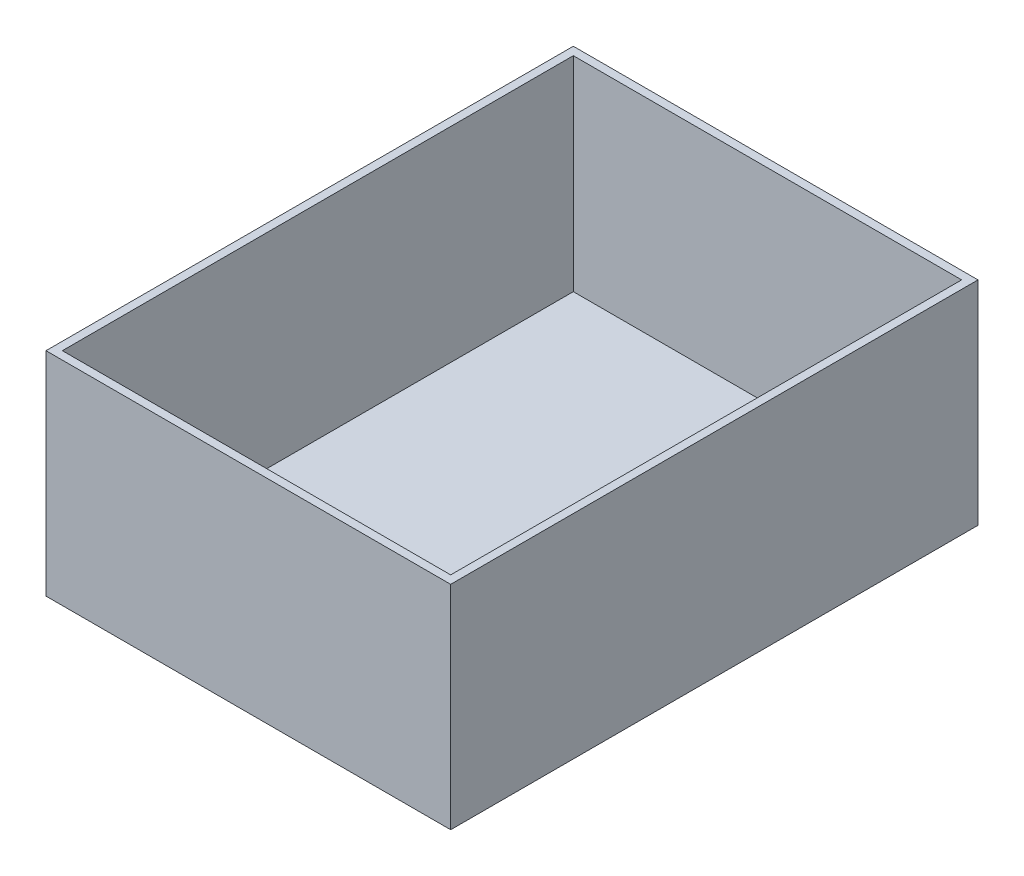
ISO-10303-21;
HEADER;
FILE_DESCRIPTION(('STEP AP214'),'2;1');
FILE_NAME('part.step','',(''),(''),'','','');
FILE_SCHEMA(('AUTOMOTIVE_DESIGN { 1 0 10303 214 1 1 1 1 }'));
ENDSEC;
DATA;
#1=APPLICATION_CONTEXT('core data for automotive mechanical design processes');
#2=APPLICATION_PROTOCOL_DEFINITION('international standard','automotive_design',2000,#1);
#3=PRODUCT_CONTEXT('',#1,'mechanical');
#4=PRODUCT('Part','Part','',(#3));
#5=PRODUCT_RELATED_PRODUCT_CATEGORY('part','',(#4));
#6=PRODUCT_DEFINITION_FORMATION('','',#4);
#7=PRODUCT_DEFINITION_CONTEXT('part definition',#1,'design');
#8=PRODUCT_DEFINITION('design','',#6,#7);
#9=PRODUCT_DEFINITION_SHAPE('','',#8);
#10=(LENGTH_UNIT() NAMED_UNIT(*) SI_UNIT(.MILLI.,.METRE.));
#11=(NAMED_UNIT(*) PLANE_ANGLE_UNIT() SI_UNIT($,.RADIAN.));
#12=(NAMED_UNIT(*) SI_UNIT($,.STERADIAN.) SOLID_ANGLE_UNIT());
#13=UNCERTAINTY_MEASURE_WITH_UNIT(LENGTH_MEASURE(1.E-05),#10,'distance_accuracy_value','');
#14=(GEOMETRIC_REPRESENTATION_CONTEXT(3) GLOBAL_UNCERTAINTY_ASSIGNED_CONTEXT((#13)) GLOBAL_UNIT_ASSIGNED_CONTEXT((#10,
#11,#12)) REPRESENTATION_CONTEXT('',''));
#15=CARTESIAN_POINT('',(0.,0.,0.));
#16=DIRECTION('',(0.,0.,1.));
#17=DIRECTION('',(1.,0.,0.));
#18=AXIS2_PLACEMENT_3D('',#15,#16,#17);
#19=CARTESIAN_POINT('',(0.,50.,0.));
#20=DIRECTION('',(0.,-1.,0.));
#21=DIRECTION('',(0.,0.,-1.));
#22=AXIS2_PLACEMENT_3D('',#19,#20,#21);
#23=PLANE('',#22);
#24=DIRECTION('',(-1.,0.,0.));
#25=VECTOR('',#24,1.);
#26=CARTESIAN_POINT('',(-49.5,50.,-64.5));
#27=LINE('',#26,#25);
#28=CARTESIAN_POINT('',(49.5,50.,-64.5));
#29=VERTEX_POINT('',#28);
#30=CARTESIAN_POINT('',(-49.5,50.,-64.5));
#31=VERTEX_POINT('',#30);
#32=EDGE_CURVE('E153',#29,#31,#27,.T.);
#33=ORIENTED_EDGE('',*,*,#32,.T.);
#34=DIRECTION('',(0.,0.,1.));
#35=VECTOR('',#34,1.);
#36=CARTESIAN_POINT('',(-49.5,50.,-64.5));
#37=LINE('',#36,#35);
#38=CARTESIAN_POINT('',(-49.5,50.,64.5));
#39=VERTEX_POINT('',#38);
#40=EDGE_CURVE('E156',#31,#39,#37,.T.);
#41=ORIENTED_EDGE('',*,*,#40,.T.);
#42=DIRECTION('',(1.,0.,0.));
#43=VECTOR('',#42,1.);
#44=CARTESIAN_POINT('',(-49.5,50.,64.5));
#45=LINE('',#44,#43);
#46=CARTESIAN_POINT('',(49.5,50.,64.5));
#47=VERTEX_POINT('',#46);
#48=EDGE_CURVE('E158',#39,#47,#45,.T.);
#49=ORIENTED_EDGE('',*,*,#48,.T.);
#50=DIRECTION('',(0.,0.,-1.));
#51=VECTOR('',#50,1.);
#52=CARTESIAN_POINT('',(49.5,50.,-64.5));
#53=LINE('',#52,#51);
#54=EDGE_CURVE('E106',#47,#29,#53,.T.);
#55=ORIENTED_EDGE('',*,*,#54,.T.);
#56=EDGE_LOOP('',(#33,#41,#49,#55));
#57=FACE_BOUND('',#56,.T.);
#58=DIRECTION('',(0.,0.,-1.));
#59=VECTOR('',#58,1.);
#60=CARTESIAN_POINT('',(47.5,50.,-62.5));
#61=LINE('',#60,#59);
#62=CARTESIAN_POINT('',(47.5,50.,62.5));
#63=VERTEX_POINT('',#62);
#64=CARTESIAN_POINT('',(47.5,50.,-62.5));
#65=VERTEX_POINT('',#64);
#66=EDGE_CURVE('E128',#63,#65,#61,.T.);
#67=ORIENTED_EDGE('',*,*,#66,.F.);
#68=DIRECTION('',(1.,0.,0.));
#69=VECTOR('',#68,1.);
#70=CARTESIAN_POINT('',(-47.5,50.,62.5));
#71=LINE('',#70,#69);
#72=CARTESIAN_POINT('',(-47.5,50.,62.5));
#73=VERTEX_POINT('',#72);
#74=EDGE_CURVE('E135',#73,#63,#71,.T.);
#75=ORIENTED_EDGE('',*,*,#74,.F.);
#76=DIRECTION('',(0.,0.,1.));
#77=VECTOR('',#76,1.);
#78=CARTESIAN_POINT('',(-47.5,50.,-62.5));
#79=LINE('',#78,#77);
#80=CARTESIAN_POINT('',(-47.5,50.,-62.5));
#81=VERTEX_POINT('',#80);
#82=EDGE_CURVE('E133',#81,#73,#79,.T.);
#83=ORIENTED_EDGE('',*,*,#82,.F.);
#84=DIRECTION('',(-1.,0.,0.));
#85=VECTOR('',#84,1.);
#86=CARTESIAN_POINT('',(-47.5,50.,-62.5));
#87=LINE('',#86,#85);
#88=EDGE_CURVE('E130',#65,#81,#87,.T.);
#89=ORIENTED_EDGE('',*,*,#88,.F.);
#90=EDGE_LOOP('',(#67,#75,#83,#89));
#91=FACE_BOUND('',#90,.T.);
#92=ADVANCED_FACE('F33',(#57,#91),#23,.F.);
#93=CARTESIAN_POINT('',(-49.5,50.,-64.5));
#94=DIRECTION('',(0.,0.,1.));
#95=DIRECTION('',(1.,0.,0.));
#96=AXIS2_PLACEMENT_3D('',#93,#94,#95);
#97=PLANE('',#96);
#98=DIRECTION('',(0.,-1.,0.));
#99=VECTOR('',#98,1.);
#100=CARTESIAN_POINT('',(49.5,50.,-64.5));
#101=LINE('',#100,#99);
#102=CARTESIAN_POINT('',(49.5,-2.,-64.5));
#103=VERTEX_POINT('',#102);
#104=EDGE_CURVE('E109',#29,#103,#101,.T.);
#105=ORIENTED_EDGE('',*,*,#104,.T.);
#106=DIRECTION('',(1.,0.,0.));
#107=VECTOR('',#106,1.);
#108=CARTESIAN_POINT('',(-49.5,-2.,-64.5));
#109=LINE('',#108,#107);
#110=CARTESIAN_POINT('',(-49.5,-2.,-64.5));
#111=VERTEX_POINT('',#110);
#112=EDGE_CURVE('E123',#111,#103,#109,.T.);
#113=ORIENTED_EDGE('',*,*,#112,.F.);
#114=DIRECTION('',(0.,-1.,0.));
#115=VECTOR('',#114,1.);
#116=CARTESIAN_POINT('',(-49.5,50.,-64.5));
#117=LINE('',#116,#115);
#118=EDGE_CURVE('E11',#31,#111,#117,.T.);
#119=ORIENTED_EDGE('',*,*,#118,.F.);
#120=ORIENTED_EDGE('',*,*,#32,.F.);
#121=EDGE_LOOP('',(#105,#113,#119,#120));
#122=FACE_BOUND('',#121,.T.);
#123=ADVANCED_FACE('F35',(#122),#97,.F.);
#124=CARTESIAN_POINT('',(-49.5,50.,-64.5));
#125=DIRECTION('',(1.,0.,0.));
#126=DIRECTION('',(0.,0.,-1.));
#127=AXIS2_PLACEMENT_3D('',#124,#125,#126);
#128=PLANE('',#127);
#129=ORIENTED_EDGE('',*,*,#118,.T.);
#130=DIRECTION('',(0.,0.,-1.));
#131=VECTOR('',#130,1.);
#132=CARTESIAN_POINT('',(-49.5,-2.,-64.5));
#133=LINE('',#132,#131);
#134=CARTESIAN_POINT('',(-49.5,-2.,64.5));
#135=VERTEX_POINT('',#134);
#136=EDGE_CURVE('E118',#135,#111,#133,.T.);
#137=ORIENTED_EDGE('',*,*,#136,.F.);
#138=DIRECTION('',(0.,-1.,0.));
#139=VECTOR('',#138,1.);
#140=CARTESIAN_POINT('',(-49.5,50.,64.5));
#141=LINE('',#140,#139);
#142=EDGE_CURVE('E41',#39,#135,#141,.T.);
#143=ORIENTED_EDGE('',*,*,#142,.F.);
#144=ORIENTED_EDGE('',*,*,#40,.F.);
#145=EDGE_LOOP('',(#129,#137,#143,#144));
#146=FACE_BOUND('',#145,.T.);
#147=ADVANCED_FACE('F167',(#146),#128,.F.);
#148=CARTESIAN_POINT('',(-49.5,50.,64.5));
#149=DIRECTION('',(0.,0.,-1.));
#150=DIRECTION('',(-1.,0.,0.));
#151=AXIS2_PLACEMENT_3D('',#148,#149,#150);
#152=PLANE('',#151);
#153=ORIENTED_EDGE('',*,*,#142,.T.);
#154=DIRECTION('',(-1.,0.,0.));
#155=VECTOR('',#154,1.);
#156=CARTESIAN_POINT('',(-49.5,-2.,64.5));
#157=LINE('',#156,#155);
#158=CARTESIAN_POINT('',(49.5,-2.,64.5));
#159=VERTEX_POINT('',#158);
#160=EDGE_CURVE('E112',#159,#135,#157,.T.);
#161=ORIENTED_EDGE('',*,*,#160,.F.);
#162=DIRECTION('',(0.,-1.,0.));
#163=VECTOR('',#162,1.);
#164=CARTESIAN_POINT('',(49.5,50.,64.5));
#165=LINE('',#164,#163);
#166=EDGE_CURVE('E100',#47,#159,#165,.T.);
#167=ORIENTED_EDGE('',*,*,#166,.F.);
#168=ORIENTED_EDGE('',*,*,#48,.F.);
#169=EDGE_LOOP('',(#153,#161,#167,#168));
#170=FACE_BOUND('',#169,.T.);
#171=ADVANCED_FACE('F113',(#170),#152,.F.);
#172=CARTESIAN_POINT('',(49.5,50.,-64.5));
#173=DIRECTION('',(-1.,0.,0.));
#174=DIRECTION('',(0.,0.,1.));
#175=AXIS2_PLACEMENT_3D('',#172,#173,#174);
#176=PLANE('',#175);
#177=ORIENTED_EDGE('',*,*,#166,.T.);
#178=DIRECTION('',(0.,0.,1.));
#179=VECTOR('',#178,1.);
#180=CARTESIAN_POINT('',(49.5,-2.,-64.5));
#181=LINE('',#180,#179);
#182=EDGE_CURVE('E105',#103,#159,#181,.T.);
#183=ORIENTED_EDGE('',*,*,#182,.F.);
#184=ORIENTED_EDGE('',*,*,#104,.F.);
#185=ORIENTED_EDGE('',*,*,#54,.F.);
#186=EDGE_LOOP('',(#177,#183,#184,#185));
#187=FACE_BOUND('',#186,.T.);
#188=ADVANCED_FACE('F102',(#187),#176,.F.);
#189=CARTESIAN_POINT('',(47.5,50.,-62.5));
#190=DIRECTION('',(-1.,0.,0.));
#191=DIRECTION('',(0.,0.,1.));
#192=AXIS2_PLACEMENT_3D('',#189,#190,#191);
#193=PLANE('',#192);
#194=DIRECTION('',(0.,0.,-1.));
#195=VECTOR('',#194,1.);
#196=CARTESIAN_POINT('',(47.5,0.,-62.5));
#197=LINE('',#196,#195);
#198=CARTESIAN_POINT('',(47.5,0.,62.5));
#199=VERTEX_POINT('',#198);
#200=CARTESIAN_POINT('',(47.5,0.,-62.5));
#201=VERTEX_POINT('',#200);
#202=EDGE_CURVE('E56',#199,#201,#197,.T.);
#203=ORIENTED_EDGE('',*,*,#202,.F.);
#204=DIRECTION('',(0.,-1.,0.));
#205=VECTOR('',#204,1.);
#206=CARTESIAN_POINT('',(47.5,50.,62.5));
#207=LINE('',#206,#205);
#208=EDGE_CURVE('E137',#63,#199,#207,.T.);
#209=ORIENTED_EDGE('',*,*,#208,.F.);
#210=ORIENTED_EDGE('',*,*,#66,.T.);
#211=DIRECTION('',(0.,-1.,0.));
#212=VECTOR('',#211,1.);
#213=CARTESIAN_POINT('',(47.5,50.,-62.5));
#214=LINE('',#213,#212);
#215=EDGE_CURVE('E151',#65,#201,#214,.T.);
#216=ORIENTED_EDGE('',*,*,#215,.T.);
#217=EDGE_LOOP('',(#203,#209,#210,#216));
#218=FACE_BOUND('',#217,.T.);
#219=ADVANCED_FACE('F180',(#218),#193,.T.);
#220=CARTESIAN_POINT('',(-47.5,50.,-62.5));
#221=DIRECTION('',(0.,0.,1.));
#222=DIRECTION('',(1.,0.,0.));
#223=AXIS2_PLACEMENT_3D('',#220,#221,#222);
#224=PLANE('',#223);
#225=DIRECTION('',(-1.,0.,0.));
#226=VECTOR('',#225,1.);
#227=CARTESIAN_POINT('',(-47.5,0.,-62.5));
#228=LINE('',#227,#226);
#229=CARTESIAN_POINT('',(-47.5,0.,-62.5));
#230=VERTEX_POINT('',#229);
#231=EDGE_CURVE('E139',#201,#230,#228,.T.);
#232=ORIENTED_EDGE('',*,*,#231,.F.);
#233=ORIENTED_EDGE('',*,*,#215,.F.);
#234=ORIENTED_EDGE('',*,*,#88,.T.);
#235=DIRECTION('',(0.,-1.,0.));
#236=VECTOR('',#235,1.);
#237=CARTESIAN_POINT('',(-47.5,50.,-62.5));
#238=LINE('',#237,#236);
#239=EDGE_CURVE('E149',#81,#230,#238,.T.);
#240=ORIENTED_EDGE('',*,*,#239,.T.);
#241=EDGE_LOOP('',(#232,#233,#234,#240));
#242=FACE_BOUND('',#241,.T.);
#243=ADVANCED_FACE('F186',(#242),#224,.T.);
#244=CARTESIAN_POINT('',(-47.5,50.,-62.5));
#245=DIRECTION('',(1.,0.,0.));
#246=DIRECTION('',(0.,0.,-1.));
#247=AXIS2_PLACEMENT_3D('',#244,#245,#246);
#248=PLANE('',#247);
#249=DIRECTION('',(0.,0.,1.));
#250=VECTOR('',#249,1.);
#251=CARTESIAN_POINT('',(-47.5,0.,-62.5));
#252=LINE('',#251,#250);
#253=CARTESIAN_POINT('',(-47.5,0.,62.5));
#254=VERTEX_POINT('',#253);
#255=EDGE_CURVE('E142',#230,#254,#252,.T.);
#256=ORIENTED_EDGE('',*,*,#255,.F.);
#257=ORIENTED_EDGE('',*,*,#239,.F.);
#258=ORIENTED_EDGE('',*,*,#82,.T.);
#259=DIRECTION('',(0.,-1.,0.));
#260=VECTOR('',#259,1.);
#261=CARTESIAN_POINT('',(-47.5,50.,62.5));
#262=LINE('',#261,#260);
#263=EDGE_CURVE('E48',#73,#254,#262,.T.);
#264=ORIENTED_EDGE('',*,*,#263,.T.);
#265=EDGE_LOOP('',(#256,#257,#258,#264));
#266=FACE_BOUND('',#265,.T.);
#267=ADVANCED_FACE('F190',(#266),#248,.T.);
#268=CARTESIAN_POINT('',(-47.5,50.,62.5));
#269=DIRECTION('',(0.,0.,-1.));
#270=DIRECTION('',(-1.,0.,0.));
#271=AXIS2_PLACEMENT_3D('',#268,#269,#270);
#272=PLANE('',#271);
#273=DIRECTION('',(1.,0.,0.));
#274=VECTOR('',#273,1.);
#275=CARTESIAN_POINT('',(-47.5,0.,62.5));
#276=LINE('',#275,#274);
#277=EDGE_CURVE('E131',#254,#199,#276,.T.);
#278=ORIENTED_EDGE('',*,*,#277,.F.);
#279=ORIENTED_EDGE('',*,*,#263,.F.);
#280=ORIENTED_EDGE('',*,*,#74,.T.);
#281=ORIENTED_EDGE('',*,*,#208,.T.);
#282=EDGE_LOOP('',(#278,#279,#280,#281));
#283=FACE_BOUND('',#282,.T.);
#284=ADVANCED_FACE('F195',(#283),#272,.T.);
#285=CARTESIAN_POINT('',(0.,0.,0.));
#286=DIRECTION('',(0.,1.,0.));
#287=DIRECTION('',(0.,0.,1.));
#288=AXIS2_PLACEMENT_3D('',#285,#286,#287);
#289=PLANE('',#288);
#290=ORIENTED_EDGE('',*,*,#255,.T.);
#291=ORIENTED_EDGE('',*,*,#277,.T.);
#292=ORIENTED_EDGE('',*,*,#202,.T.);
#293=ORIENTED_EDGE('',*,*,#231,.T.);
#294=EDGE_LOOP('',(#290,#291,#292,#293));
#295=FACE_BOUND('',#294,.T.);
#296=ADVANCED_FACE('F201',(#295),#289,.T.);
#297=CARTESIAN_POINT('',(0.,-2.,0.));
#298=DIRECTION('',(0.,1.,0.));
#299=DIRECTION('',(0.,0.,1.));
#300=AXIS2_PLACEMENT_3D('',#297,#298,#299);
#301=PLANE('',#300);
#302=ORIENTED_EDGE('',*,*,#182,.T.);
#303=ORIENTED_EDGE('',*,*,#160,.T.);
#304=ORIENTED_EDGE('',*,*,#136,.T.);
#305=ORIENTED_EDGE('',*,*,#112,.T.);
#306=EDGE_LOOP('',(#302,#303,#304,#305));
#307=FACE_BOUND('',#306,.T.);
#308=ADVANCED_FACE('F121',(#307),#301,.F.);
#309=CLOSED_SHELL('',(#92,#123,#147,#171,#188,#219,#243,#267,#284,#296,#308));
#310=MANIFOLD_SOLID_BREP('B2',#309);
#311=ADVANCED_BREP_SHAPE_REPRESENTATION('',(#18,#310),#14);
#312=SHAPE_DEFINITION_REPRESENTATION(#9,#311);
ENDSEC;
END-ISO-10303-21;
